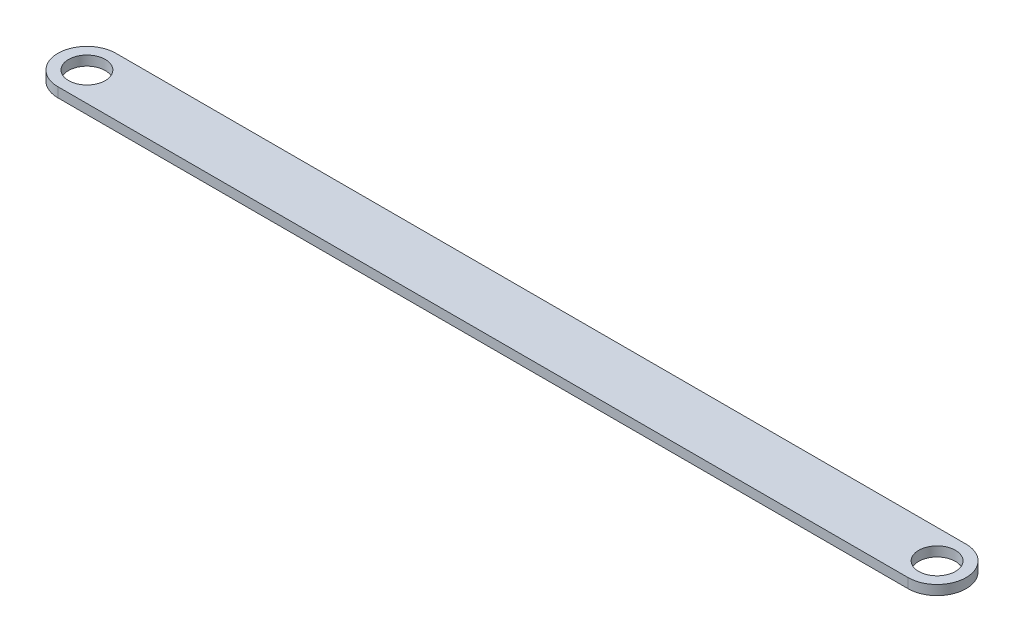
ISO-10303-21;
HEADER;
FILE_DESCRIPTION(('STEP AP214'),'2;1');
FILE_NAME('part.step','',(''),(''),'','','');
FILE_SCHEMA(('AUTOMOTIVE_DESIGN { 1 0 10303 214 1 1 1 1 }'));
ENDSEC;
DATA;
#1=APPLICATION_CONTEXT('core data for automotive mechanical design processes');
#2=APPLICATION_PROTOCOL_DEFINITION('international standard','automotive_design',2000,#1);
#3=PRODUCT_CONTEXT('',#1,'mechanical');
#4=PRODUCT('Part','Part','',(#3));
#5=PRODUCT_RELATED_PRODUCT_CATEGORY('part','',(#4));
#6=PRODUCT_DEFINITION_FORMATION('','',#4);
#7=PRODUCT_DEFINITION_CONTEXT('part definition',#1,'design');
#8=PRODUCT_DEFINITION('design','',#6,#7);
#9=PRODUCT_DEFINITION_SHAPE('','',#8);
#10=(LENGTH_UNIT() NAMED_UNIT(*) SI_UNIT(.MILLI.,.METRE.));
#11=(NAMED_UNIT(*) PLANE_ANGLE_UNIT() SI_UNIT($,.RADIAN.));
#12=(NAMED_UNIT(*) SI_UNIT($,.STERADIAN.) SOLID_ANGLE_UNIT());
#13=UNCERTAINTY_MEASURE_WITH_UNIT(LENGTH_MEASURE(1.E-05),#10,'distance_accuracy_value','');
#14=(GEOMETRIC_REPRESENTATION_CONTEXT(3) GLOBAL_UNCERTAINTY_ASSIGNED_CONTEXT((#13)) GLOBAL_UNIT_ASSIGNED_CONTEXT((#10,
#11,#12)) REPRESENTATION_CONTEXT('',''));
#15=CARTESIAN_POINT('',(0.,0.,0.));
#16=DIRECTION('',(0.,0.,1.));
#17=DIRECTION('',(1.,0.,0.));
#18=AXIS2_PLACEMENT_3D('',#15,#16,#17);
#19=CARTESIAN_POINT('',(-110.,2.5,0.));
#20=DIRECTION('',(0.,-1.,0.));
#21=DIRECTION('',(0.,0.,-1.));
#22=AXIS2_PLACEMENT_3D('',#19,#20,#21);
#23=CYLINDRICAL_SURFACE('',#22,7.5);
#24=CARTESIAN_POINT('',(-110.,0.,0.));
#25=DIRECTION('',(0.,1.,0.));
#26=DIRECTION('',(0.,0.,1.));
#27=AXIS2_PLACEMENT_3D('',#24,#25,#26);
#28=CIRCLE('',#27,7.5);
#29=CARTESIAN_POINT('',(-110.,0.,-7.5));
#30=VERTEX_POINT('',#29);
#31=CARTESIAN_POINT('',(-110.,0.,7.5));
#32=VERTEX_POINT('',#31);
#33=EDGE_CURVE('E107',#30,#32,#28,.T.);
#34=ORIENTED_EDGE('',*,*,#33,.T.);
#35=DIRECTION('',(0.,-1.,0.));
#36=VECTOR('',#35,1.);
#37=CARTESIAN_POINT('',(-110.,2.5,7.5));
#38=LINE('',#37,#36);
#39=CARTESIAN_POINT('',(-110.,2.5,7.5));
#40=VERTEX_POINT('',#39);
#41=EDGE_CURVE('E11',#40,#32,#38,.T.);
#42=ORIENTED_EDGE('',*,*,#41,.F.);
#43=CARTESIAN_POINT('',(-110.,2.5,0.));
#44=DIRECTION('',(0.,1.,0.));
#45=DIRECTION('',(0.,0.,1.));
#46=AXIS2_PLACEMENT_3D('',#43,#44,#45);
#47=CIRCLE('',#46,7.5);
#48=CARTESIAN_POINT('',(-110.,2.5,-7.5));
#49=VERTEX_POINT('',#48);
#50=EDGE_CURVE('E91',#49,#40,#47,.T.);
#51=ORIENTED_EDGE('',*,*,#50,.F.);
#52=DIRECTION('',(0.,-1.,0.));
#53=VECTOR('',#52,1.);
#54=CARTESIAN_POINT('',(-110.,2.5,-7.5));
#55=LINE('',#54,#53);
#56=EDGE_CURVE('E103',#49,#30,#55,.T.);
#57=ORIENTED_EDGE('',*,*,#56,.T.);
#58=EDGE_LOOP('',(#34,#42,#51,#57));
#59=FACE_BOUND('',#58,.T.);
#60=ADVANCED_FACE('F39',(#59),#23,.T.);
#61=CARTESIAN_POINT('',(-110.,2.5,7.5));
#62=DIRECTION('',(0.,0.,-1.));
#63=DIRECTION('',(-1.,0.,0.));
#64=AXIS2_PLACEMENT_3D('',#61,#62,#63);
#65=PLANE('',#64);
#66=DIRECTION('',(1.,0.,0.));
#67=VECTOR('',#66,1.);
#68=CARTESIAN_POINT('',(-110.,0.,7.5));
#69=LINE('',#68,#67);
#70=CARTESIAN_POINT('',(110.,0.,7.49999999999996));
#71=VERTEX_POINT('',#70);
#72=EDGE_CURVE('E96',#32,#71,#69,.T.);
#73=ORIENTED_EDGE('',*,*,#72,.T.);
#74=DIRECTION('',(0.,-1.,0.));
#75=VECTOR('',#74,1.);
#76=CARTESIAN_POINT('',(110.,2.5,7.49999999999996));
#77=LINE('',#76,#75);
#78=CARTESIAN_POINT('',(110.,2.5,7.49999999999996));
#79=VERTEX_POINT('',#78);
#80=EDGE_CURVE('E48',#79,#71,#77,.T.);
#81=ORIENTED_EDGE('',*,*,#80,.F.);
#82=DIRECTION('',(1.,0.,0.));
#83=VECTOR('',#82,1.);
#84=CARTESIAN_POINT('',(-110.,2.5,7.5));
#85=LINE('',#84,#83);
#86=EDGE_CURVE('E86',#40,#79,#85,.T.);
#87=ORIENTED_EDGE('',*,*,#86,.F.);
#88=ORIENTED_EDGE('',*,*,#41,.T.);
#89=EDGE_LOOP('',(#73,#81,#87,#88));
#90=FACE_BOUND('',#89,.T.);
#91=ADVANCED_FACE('F95',(#90),#65,.F.);
#92=CARTESIAN_POINT('',(110.,2.5,0.));
#93=DIRECTION('',(0.,-1.,0.));
#94=DIRECTION('',(0.,0.,-1.));
#95=AXIS2_PLACEMENT_3D('',#92,#93,#94);
#96=CYLINDRICAL_SURFACE('',#95,7.5);
#97=CARTESIAN_POINT('',(110.,0.,0.));
#98=DIRECTION('',(0.,1.,0.));
#99=DIRECTION('',(0.,0.,1.));
#100=AXIS2_PLACEMENT_3D('',#97,#98,#99);
#101=CIRCLE('',#100,7.5);
#102=CARTESIAN_POINT('',(110.,0.,-7.50000000000004));
#103=VERTEX_POINT('',#102);
#104=EDGE_CURVE('E73',#71,#103,#101,.T.);
#105=ORIENTED_EDGE('',*,*,#104,.T.);
#106=DIRECTION('',(0.,-1.,0.));
#107=VECTOR('',#106,1.);
#108=CARTESIAN_POINT('',(110.,2.5,-7.50000000000004));
#109=LINE('',#108,#107);
#110=CARTESIAN_POINT('',(110.,2.5,-7.50000000000004));
#111=VERTEX_POINT('',#110);
#112=EDGE_CURVE('E98',#111,#103,#109,.T.);
#113=ORIENTED_EDGE('',*,*,#112,.F.);
#114=CARTESIAN_POINT('',(110.,2.5,0.));
#115=DIRECTION('',(0.,1.,0.));
#116=DIRECTION('',(0.,0.,1.));
#117=AXIS2_PLACEMENT_3D('',#114,#115,#116);
#118=CIRCLE('',#117,7.5);
#119=EDGE_CURVE('E89',#79,#111,#118,.T.);
#120=ORIENTED_EDGE('',*,*,#119,.F.);
#121=ORIENTED_EDGE('',*,*,#80,.T.);
#122=EDGE_LOOP('',(#105,#113,#120,#121));
#123=FACE_BOUND('',#122,.T.);
#124=ADVANCED_FACE('F99',(#123),#96,.T.);
#125=CARTESIAN_POINT('',(-110.,2.5,-7.5));
#126=DIRECTION('',(0.,0.,1.));
#127=DIRECTION('',(1.,0.,0.));
#128=AXIS2_PLACEMENT_3D('',#125,#126,#127);
#129=PLANE('',#128);
#130=DIRECTION('',(-1.,0.,0.));
#131=VECTOR('',#130,1.);
#132=CARTESIAN_POINT('',(-110.,0.,-7.5));
#133=LINE('',#132,#131);
#134=EDGE_CURVE('E79',#103,#30,#133,.T.);
#135=ORIENTED_EDGE('',*,*,#134,.T.);
#136=ORIENTED_EDGE('',*,*,#56,.F.);
#137=DIRECTION('',(-1.,0.,0.));
#138=VECTOR('',#137,1.);
#139=CARTESIAN_POINT('',(-110.,2.5,-7.5));
#140=LINE('',#139,#138);
#141=EDGE_CURVE('E56',#111,#49,#140,.T.);
#142=ORIENTED_EDGE('',*,*,#141,.F.);
#143=ORIENTED_EDGE('',*,*,#112,.T.);
#144=EDGE_LOOP('',(#135,#136,#142,#143));
#145=FACE_BOUND('',#144,.T.);
#146=ADVANCED_FACE('F121',(#145),#129,.F.);
#147=CARTESIAN_POINT('',(-110.,2.5,0.));
#148=DIRECTION('',(0.,1.,0.));
#149=DIRECTION('',(0.,0.,1.));
#150=AXIS2_PLACEMENT_3D('',#147,#148,#149);
#151=PLANE('',#150);
#152=CARTESIAN_POINT('',(-110.,2.5,0.));
#153=DIRECTION('',(0.,1.,0.));
#154=DIRECTION('',(0.,0.,1.));
#155=AXIS2_PLACEMENT_3D('',#152,#153,#154);
#156=CIRCLE('',#155,4.75);
#157=CARTESIAN_POINT('',(-110.,2.5,4.75));
#158=VERTEX_POINT('',#157);
#159=EDGE_CURVE('E136',#158,#158,#156,.T.);
#160=ORIENTED_EDGE('',*,*,#159,.F.);
#161=EDGE_LOOP('',(#160));
#162=FACE_BOUND('',#161,.T.);
#163=CARTESIAN_POINT('',(110.,2.5,0.));
#164=DIRECTION('',(0.,1.,0.));
#165=DIRECTION('',(0.,0.,1.));
#166=AXIS2_PLACEMENT_3D('',#163,#164,#165);
#167=CIRCLE('',#166,4.75);
#168=CARTESIAN_POINT('',(110.,2.5,4.74999999999996));
#169=VERTEX_POINT('',#168);
#170=EDGE_CURVE('E128',#169,#169,#167,.T.);
#171=ORIENTED_EDGE('',*,*,#170,.F.);
#172=EDGE_LOOP('',(#171));
#173=FACE_BOUND('',#172,.T.);
#174=ORIENTED_EDGE('',*,*,#50,.T.);
#175=ORIENTED_EDGE('',*,*,#86,.T.);
#176=ORIENTED_EDGE('',*,*,#119,.T.);
#177=ORIENTED_EDGE('',*,*,#141,.T.);
#178=EDGE_LOOP('',(#174,#175,#176,#177));
#179=FACE_BOUND('',#178,.T.);
#180=ADVANCED_FACE('F87',(#162,#173,#179),#151,.T.);
#181=CARTESIAN_POINT('',(-110.,0.,0.));
#182=DIRECTION('',(0.,1.,0.));
#183=DIRECTION('',(0.,0.,1.));
#184=AXIS2_PLACEMENT_3D('',#181,#182,#183);
#185=PLANE('',#184);
#186=CARTESIAN_POINT('',(-110.,0.,0.));
#187=DIRECTION('',(0.,1.,0.));
#188=DIRECTION('',(0.,0.,1.));
#189=AXIS2_PLACEMENT_3D('',#186,#187,#188);
#190=CIRCLE('',#189,4.75);
#191=CARTESIAN_POINT('',(-110.,0.,4.75));
#192=VERTEX_POINT('',#191);
#193=EDGE_CURVE('E111',#192,#192,#190,.T.);
#194=ORIENTED_EDGE('',*,*,#193,.T.);
#195=EDGE_LOOP('',(#194));
#196=FACE_BOUND('',#195,.T.);
#197=CARTESIAN_POINT('',(110.,0.,0.));
#198=DIRECTION('',(0.,1.,0.));
#199=DIRECTION('',(0.,0.,1.));
#200=AXIS2_PLACEMENT_3D('',#197,#198,#199);
#201=CIRCLE('',#200,4.75);
#202=CARTESIAN_POINT('',(110.,0.,4.74999999999996));
#203=VERTEX_POINT('',#202);
#204=EDGE_CURVE('E132',#203,#203,#201,.T.);
#205=ORIENTED_EDGE('',*,*,#204,.T.);
#206=EDGE_LOOP('',(#205));
#207=FACE_BOUND('',#206,.T.);
#208=ORIENTED_EDGE('',*,*,#33,.F.);
#209=ORIENTED_EDGE('',*,*,#134,.F.);
#210=ORIENTED_EDGE('',*,*,#104,.F.);
#211=ORIENTED_EDGE('',*,*,#72,.F.);
#212=EDGE_LOOP('',(#208,#209,#210,#211));
#213=FACE_BOUND('',#212,.T.);
#214=ADVANCED_FACE('F124',(#196,#207,#213),#185,.F.);
#215=CARTESIAN_POINT('',(110.,0.,0.));
#216=DIRECTION('',(0.,1.,0.));
#217=DIRECTION('',(0.,0.,1.));
#218=AXIS2_PLACEMENT_3D('',#215,#216,#217);
#219=CYLINDRICAL_SURFACE('',#218,4.75);
#220=ORIENTED_EDGE('',*,*,#204,.F.);
#221=EDGE_LOOP('',(#220));
#222=FACE_BOUND('',#221,.T.);
#223=ORIENTED_EDGE('',*,*,#170,.T.);
#224=EDGE_LOOP('',(#223));
#225=FACE_BOUND('',#224,.T.);
#226=ADVANCED_FACE('F149',(#222,#225),#219,.F.);
#227=CARTESIAN_POINT('',(-110.,0.,0.));
#228=DIRECTION('',(0.,1.,0.));
#229=DIRECTION('',(0.,0.,1.));
#230=AXIS2_PLACEMENT_3D('',#227,#228,#229);
#231=CYLINDRICAL_SURFACE('',#230,4.75);
#232=ORIENTED_EDGE('',*,*,#193,.F.);
#233=EDGE_LOOP('',(#232));
#234=FACE_BOUND('',#233,.T.);
#235=ORIENTED_EDGE('',*,*,#159,.T.);
#236=EDGE_LOOP('',(#235));
#237=FACE_BOUND('',#236,.T.);
#238=ADVANCED_FACE('F146',(#234,#237),#231,.F.);
#239=CLOSED_SHELL('',(#60,#91,#124,#146,#180,#214,#226,#238));
#240=MANIFOLD_SOLID_BREP('B2',#239);
#241=ADVANCED_BREP_SHAPE_REPRESENTATION('',(#18,#240),#14);
#242=SHAPE_DEFINITION_REPRESENTATION(#9,#241);
ENDSEC;
END-ISO-10303-21;
